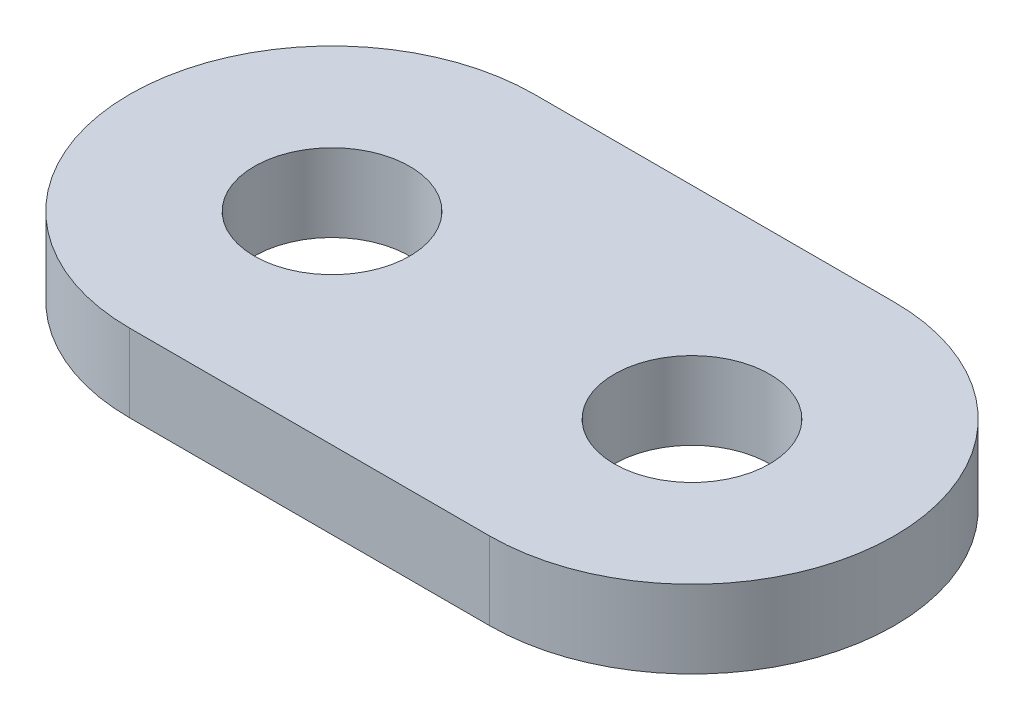
ISO-10303-21;
HEADER;
FILE_DESCRIPTION(('STEP AP214'),'2;1');
FILE_NAME('part.step','',(''),(''),'','','');
FILE_SCHEMA(('AUTOMOTIVE_DESIGN { 1 0 10303 214 1 1 1 1 }'));
ENDSEC;
DATA;
#1=APPLICATION_CONTEXT('core data for automotive mechanical design processes');
#2=APPLICATION_PROTOCOL_DEFINITION('international standard','automotive_design',2000,#1);
#3=PRODUCT_CONTEXT('',#1,'mechanical');
#4=PRODUCT('Part','Part','',(#3));
#5=PRODUCT_RELATED_PRODUCT_CATEGORY('part','',(#4));
#6=PRODUCT_DEFINITION_FORMATION('','',#4);
#7=PRODUCT_DEFINITION_CONTEXT('part definition',#1,'design');
#8=PRODUCT_DEFINITION('design','',#6,#7);
#9=PRODUCT_DEFINITION_SHAPE('','',#8);
#10=(LENGTH_UNIT() NAMED_UNIT(*) SI_UNIT(.MILLI.,.METRE.));
#11=(NAMED_UNIT(*) PLANE_ANGLE_UNIT() SI_UNIT($,.RADIAN.));
#12=(NAMED_UNIT(*) SI_UNIT($,.STERADIAN.) SOLID_ANGLE_UNIT());
#13=UNCERTAINTY_MEASURE_WITH_UNIT(LENGTH_MEASURE(1.E-05),#10,'distance_accuracy_value','');
#14=(GEOMETRIC_REPRESENTATION_CONTEXT(3) GLOBAL_UNCERTAINTY_ASSIGNED_CONTEXT((#13)) GLOBAL_UNIT_ASSIGNED_CONTEXT((#10,
#11,#12)) REPRESENTATION_CONTEXT('',''));
#15=CARTESIAN_POINT('',(0.,0.,0.));
#16=DIRECTION('',(0.,0.,1.));
#17=DIRECTION('',(1.,0.,0.));
#18=AXIS2_PLACEMENT_3D('',#15,#16,#17);
#19=CARTESIAN_POINT('',(0.,0.79375,4.13373631574246));
#20=DIRECTION('',(0.,0.,-1.));
#21=DIRECTION('',(-1.,0.,0.));
#22=AXIS2_PLACEMENT_3D('',#19,#20,#21);
#23=PLANE('',#22);
#24=DIRECTION('',(1.,0.,0.));
#25=VECTOR('',#24,1.);
#26=CARTESIAN_POINT('',(0.,-0.79375,4.13373631574246));
#27=LINE('',#26,#25);
#28=CARTESIAN_POINT('',(-3.675,-0.79375,4.13373631574246));
#29=VERTEX_POINT('',#28);
#30=CARTESIAN_POINT('',(3.675,-0.79375,4.13373631574246));
#31=VERTEX_POINT('',#30);
#32=EDGE_CURVE('E105',#29,#31,#27,.T.);
#33=ORIENTED_EDGE('',*,*,#32,.T.);
#34=DIRECTION('',(0.,-1.,0.));
#35=VECTOR('',#34,1.);
#36=CARTESIAN_POINT('',(3.675,0.79375,4.13373631574246));
#37=LINE('',#36,#35);
#38=CARTESIAN_POINT('',(3.675,0.79375,4.13373631574246));
#39=VERTEX_POINT('',#38);
#40=EDGE_CURVE('E11',#39,#31,#37,.T.);
#41=ORIENTED_EDGE('',*,*,#40,.F.);
#42=DIRECTION('',(1.,0.,0.));
#43=VECTOR('',#42,1.);
#44=CARTESIAN_POINT('',(0.,0.79375,4.13373631574246));
#45=LINE('',#44,#43);
#46=CARTESIAN_POINT('',(-3.675,0.79375,4.13373631574246));
#47=VERTEX_POINT('',#46);
#48=EDGE_CURVE('E87',#47,#39,#45,.T.);
#49=ORIENTED_EDGE('',*,*,#48,.F.);
#50=DIRECTION('',(0.,-1.,0.));
#51=VECTOR('',#50,1.);
#52=CARTESIAN_POINT('',(-3.675,0.79375,4.13373631574246));
#53=LINE('',#52,#51);
#54=EDGE_CURVE('E95',#47,#29,#53,.T.);
#55=ORIENTED_EDGE('',*,*,#54,.T.);
#56=EDGE_LOOP('',(#33,#41,#49,#55));
#57=FACE_BOUND('',#56,.T.);
#58=ADVANCED_FACE('F35',(#57),#23,.F.);
#59=CARTESIAN_POINT('',(3.675,0.79375,0.));
#60=DIRECTION('',(0.,-1.,0.));
#61=DIRECTION('',(0.,0.,-1.));
#62=AXIS2_PLACEMENT_3D('',#59,#60,#61);
#63=CYLINDRICAL_SURFACE('',#62,4.13373631574246);
#64=CARTESIAN_POINT('',(3.675,-0.79375,0.));
#65=DIRECTION('',(0.,1.,0.));
#66=DIRECTION('',(0.,0.,1.));
#67=AXIS2_PLACEMENT_3D('',#64,#65,#66);
#68=CIRCLE('',#67,4.13373631574246);
#69=CARTESIAN_POINT('',(3.675,-0.79375,-4.13373631574246));
#70=VERTEX_POINT('',#69);
#71=EDGE_CURVE('E91',#31,#70,#68,.T.);
#72=ORIENTED_EDGE('',*,*,#71,.T.);
#73=DIRECTION('',(0.,-1.,0.));
#74=VECTOR('',#73,1.);
#75=CARTESIAN_POINT('',(3.675,0.79375,-4.13373631574246));
#76=LINE('',#75,#74);
#77=CARTESIAN_POINT('',(3.675,0.79375,-4.13373631574246));
#78=VERTEX_POINT('',#77);
#79=EDGE_CURVE('E44',#78,#70,#76,.T.);
#80=ORIENTED_EDGE('',*,*,#79,.F.);
#81=CARTESIAN_POINT('',(3.675,0.79375,0.));
#82=DIRECTION('',(0.,1.,0.));
#83=DIRECTION('',(0.,0.,1.));
#84=AXIS2_PLACEMENT_3D('',#81,#82,#83);
#85=CIRCLE('',#84,4.13373631574246);
#86=EDGE_CURVE('E82',#39,#78,#85,.T.);
#87=ORIENTED_EDGE('',*,*,#86,.F.);
#88=ORIENTED_EDGE('',*,*,#40,.T.);
#89=EDGE_LOOP('',(#72,#80,#87,#88));
#90=FACE_BOUND('',#89,.T.);
#91=ADVANCED_FACE('F90',(#90),#63,.T.);
#92=CARTESIAN_POINT('',(0.,0.79375,-4.13373631574246));
#93=DIRECTION('',(0.,0.,1.));
#94=DIRECTION('',(1.,0.,0.));
#95=AXIS2_PLACEMENT_3D('',#92,#93,#94);
#96=PLANE('',#95);
#97=DIRECTION('',(-1.,0.,0.));
#98=VECTOR('',#97,1.);
#99=CARTESIAN_POINT('',(0.,-0.79375,-4.13373631574246));
#100=LINE('',#99,#98);
#101=CARTESIAN_POINT('',(-3.675,-0.79375,-4.13373631574246));
#102=VERTEX_POINT('',#101);
#103=EDGE_CURVE('E69',#70,#102,#100,.T.);
#104=ORIENTED_EDGE('',*,*,#103,.T.);
#105=DIRECTION('',(0.,-1.,0.));
#106=VECTOR('',#105,1.);
#107=CARTESIAN_POINT('',(-3.675,0.79375,-4.13373631574246));
#108=LINE('',#107,#106);
#109=CARTESIAN_POINT('',(-3.675,0.79375,-4.13373631574246));
#110=VERTEX_POINT('',#109);
#111=EDGE_CURVE('E92',#110,#102,#108,.T.);
#112=ORIENTED_EDGE('',*,*,#111,.F.);
#113=DIRECTION('',(-1.,0.,0.));
#114=VECTOR('',#113,1.);
#115=CARTESIAN_POINT('',(0.,0.79375,-4.13373631574246));
#116=LINE('',#115,#114);
#117=EDGE_CURVE('E85',#78,#110,#116,.T.);
#118=ORIENTED_EDGE('',*,*,#117,.F.);
#119=ORIENTED_EDGE('',*,*,#79,.T.);
#120=EDGE_LOOP('',(#104,#112,#118,#119));
#121=FACE_BOUND('',#120,.T.);
#122=ADVANCED_FACE('F93',(#121),#96,.F.);
#123=CARTESIAN_POINT('',(-3.675,0.79375,0.));
#124=DIRECTION('',(0.,-1.,0.));
#125=DIRECTION('',(0.,0.,-1.));
#126=AXIS2_PLACEMENT_3D('',#123,#124,#125);
#127=CYLINDRICAL_SURFACE('',#126,1.5875);
#128=CARTESIAN_POINT('',(-3.675,0.79375,0.));
#129=DIRECTION('',(0.,1.,0.));
#130=DIRECTION('',(0.,0.,1.));
#131=AXIS2_PLACEMENT_3D('',#128,#129,#130);
#132=CIRCLE('',#131,1.5875);
#133=CARTESIAN_POINT('',(-3.675,0.79375,1.5875));
#134=VERTEX_POINT('',#133);
#135=EDGE_CURVE('E118',#134,#134,#132,.T.);
#136=ORIENTED_EDGE('',*,*,#135,.T.);
#137=EDGE_LOOP('',(#136));
#138=FACE_BOUND('',#137,.T.);
#139=CARTESIAN_POINT('',(-3.675,-0.79375,0.));
#140=DIRECTION('',(0.,1.,0.));
#141=DIRECTION('',(0.,0.,1.));
#142=AXIS2_PLACEMENT_3D('',#139,#140,#141);
#143=CIRCLE('',#142,1.5875);
#144=CARTESIAN_POINT('',(-3.675,-0.79375,1.5875));
#145=VERTEX_POINT('',#144);
#146=EDGE_CURVE('E102',#145,#145,#143,.T.);
#147=ORIENTED_EDGE('',*,*,#146,.F.);
#148=EDGE_LOOP('',(#147));
#149=FACE_BOUND('',#148,.T.);
#150=ADVANCED_FACE('F132',(#138,#149),#127,.F.);
#151=CARTESIAN_POINT('',(3.675,0.79375,0.));
#152=DIRECTION('',(0.,-1.,0.));
#153=DIRECTION('',(0.,0.,-1.));
#154=AXIS2_PLACEMENT_3D('',#151,#152,#153);
#155=CYLINDRICAL_SURFACE('',#154,1.5875);
#156=CARTESIAN_POINT('',(3.675,0.79375,0.));
#157=DIRECTION('',(0.,1.,0.));
#158=DIRECTION('',(0.,0.,1.));
#159=AXIS2_PLACEMENT_3D('',#156,#157,#158);
#160=CIRCLE('',#159,1.5875);
#161=CARTESIAN_POINT('',(3.675,0.79375,1.5875));
#162=VERTEX_POINT('',#161);
#163=EDGE_CURVE('E111',#162,#162,#160,.T.);
#164=ORIENTED_EDGE('',*,*,#163,.T.);
#165=EDGE_LOOP('',(#164));
#166=FACE_BOUND('',#165,.T.);
#167=CARTESIAN_POINT('',(3.675,-0.79375,0.));
#168=DIRECTION('',(0.,1.,0.));
#169=DIRECTION('',(0.,0.,1.));
#170=AXIS2_PLACEMENT_3D('',#167,#168,#169);
#171=CIRCLE('',#170,1.5875);
#172=CARTESIAN_POINT('',(3.675,-0.79375,1.5875));
#173=VERTEX_POINT('',#172);
#174=EDGE_CURVE('E99',#173,#173,#171,.T.);
#175=ORIENTED_EDGE('',*,*,#174,.F.);
#176=EDGE_LOOP('',(#175));
#177=FACE_BOUND('',#176,.T.);
#178=ADVANCED_FACE('F37',(#166,#177),#155,.F.);
#179=CARTESIAN_POINT('',(-3.675,0.79375,0.));
#180=DIRECTION('',(0.,-1.,0.));
#181=DIRECTION('',(0.,0.,-1.));
#182=AXIS2_PLACEMENT_3D('',#179,#180,#181);
#183=CYLINDRICAL_SURFACE('',#182,4.13373631574246);
#184=CARTESIAN_POINT('',(-3.675,-0.79375,0.));
#185=DIRECTION('',(0.,1.,0.));
#186=DIRECTION('',(0.,0.,1.));
#187=AXIS2_PLACEMENT_3D('',#184,#185,#186);
#188=CIRCLE('',#187,4.13373631574246);
#189=EDGE_CURVE('E75',#102,#29,#188,.T.);
#190=ORIENTED_EDGE('',*,*,#189,.T.);
#191=ORIENTED_EDGE('',*,*,#54,.F.);
#192=CARTESIAN_POINT('',(-3.675,0.79375,0.));
#193=DIRECTION('',(0.,1.,0.));
#194=DIRECTION('',(0.,0.,1.));
#195=AXIS2_PLACEMENT_3D('',#192,#193,#194);
#196=CIRCLE('',#195,4.13373631574246);
#197=EDGE_CURVE('E52',#110,#47,#196,.T.);
#198=ORIENTED_EDGE('',*,*,#197,.F.);
#199=ORIENTED_EDGE('',*,*,#111,.T.);
#200=EDGE_LOOP('',(#190,#191,#198,#199));
#201=FACE_BOUND('',#200,.T.);
#202=ADVANCED_FACE('F113',(#201),#183,.T.);
#203=CARTESIAN_POINT('',(0.,0.79375,0.));
#204=DIRECTION('',(0.,1.,0.));
#205=DIRECTION('',(0.,0.,1.));
#206=AXIS2_PLACEMENT_3D('',#203,#204,#205);
#207=PLANE('',#206);
#208=ORIENTED_EDGE('',*,*,#163,.F.);
#209=EDGE_LOOP('',(#208));
#210=FACE_BOUND('',#209,.T.);
#211=ORIENTED_EDGE('',*,*,#135,.F.);
#212=EDGE_LOOP('',(#211));
#213=FACE_BOUND('',#212,.T.);
#214=ORIENTED_EDGE('',*,*,#48,.T.);
#215=ORIENTED_EDGE('',*,*,#86,.T.);
#216=ORIENTED_EDGE('',*,*,#117,.T.);
#217=ORIENTED_EDGE('',*,*,#197,.T.);
#218=EDGE_LOOP('',(#214,#215,#216,#217));
#219=FACE_BOUND('',#218,.T.);
#220=ADVANCED_FACE('F83',(#210,#213,#219),#207,.T.);
#221=CARTESIAN_POINT('',(0.,-0.79375,0.));
#222=DIRECTION('',(0.,1.,0.));
#223=DIRECTION('',(0.,0.,1.));
#224=AXIS2_PLACEMENT_3D('',#221,#222,#223);
#225=PLANE('',#224);
#226=ORIENTED_EDGE('',*,*,#174,.T.);
#227=EDGE_LOOP('',(#226));
#228=FACE_BOUND('',#227,.T.);
#229=ORIENTED_EDGE('',*,*,#146,.T.);
#230=EDGE_LOOP('',(#229));
#231=FACE_BOUND('',#230,.T.);
#232=ORIENTED_EDGE('',*,*,#32,.F.);
#233=ORIENTED_EDGE('',*,*,#189,.F.);
#234=ORIENTED_EDGE('',*,*,#103,.F.);
#235=ORIENTED_EDGE('',*,*,#71,.F.);
#236=EDGE_LOOP('',(#232,#233,#234,#235));
#237=FACE_BOUND('',#236,.T.);
#238=ADVANCED_FACE('F116',(#228,#231,#237),#225,.F.);
#239=CLOSED_SHELL('',(#58,#91,#122,#150,#178,#202,#220,#238));
#240=MANIFOLD_SOLID_BREP('B2',#239);
#241=ADVANCED_BREP_SHAPE_REPRESENTATION('',(#18,#240),#14);
#242=SHAPE_DEFINITION_REPRESENTATION(#9,#241);
ENDSEC;
END-ISO-10303-21;
